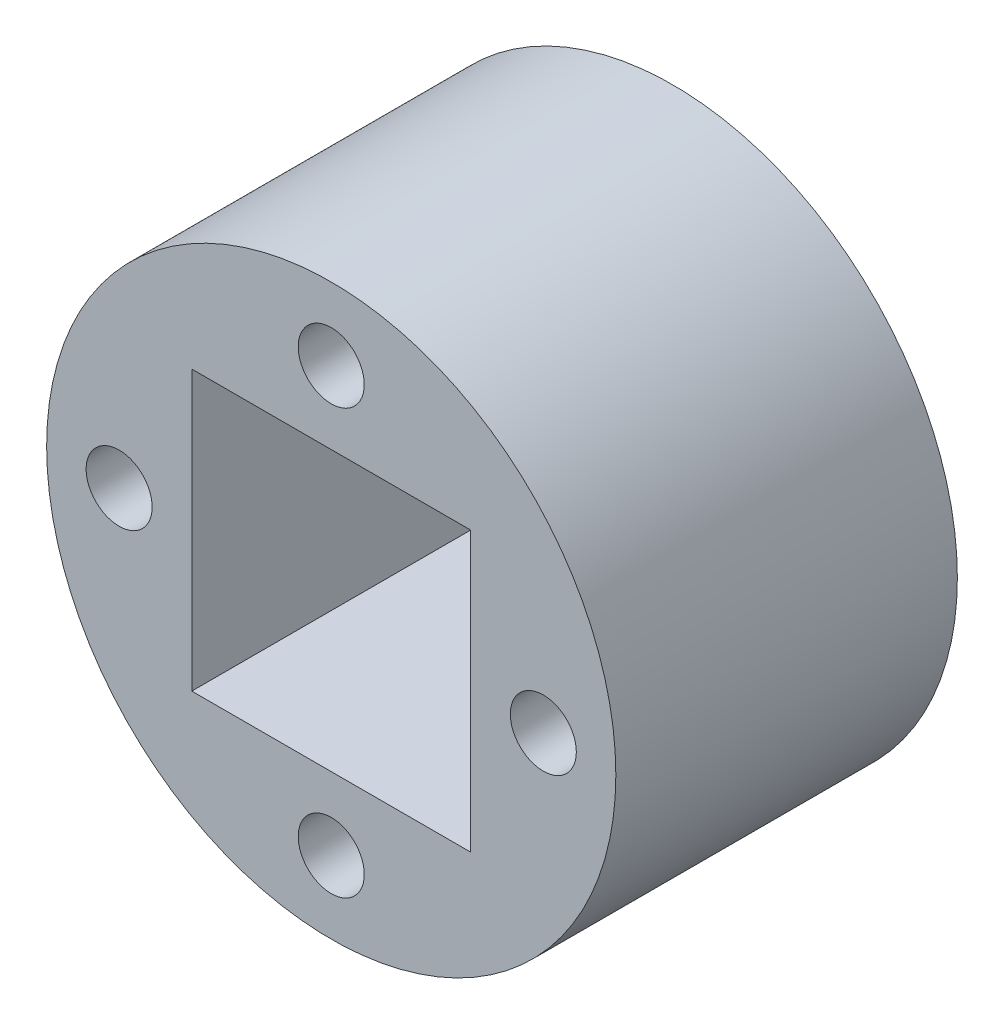
ISO-10303-21;
HEADER;
FILE_DESCRIPTION(('STEP AP214'),'2;1');
FILE_NAME('part.step','',(''),(''),'','','');
FILE_SCHEMA(('AUTOMOTIVE_DESIGN { 1 0 10303 214 1 1 1 1 }'));
ENDSEC;
DATA;
#1=APPLICATION_CONTEXT('core data for automotive mechanical design processes');
#2=APPLICATION_PROTOCOL_DEFINITION('international standard','automotive_design',2000,#1);
#3=PRODUCT_CONTEXT('',#1,'mechanical');
#4=PRODUCT('Part','Part','',(#3));
#5=PRODUCT_RELATED_PRODUCT_CATEGORY('part','',(#4));
#6=PRODUCT_DEFINITION_FORMATION('','',#4);
#7=PRODUCT_DEFINITION_CONTEXT('part definition',#1,'design');
#8=PRODUCT_DEFINITION('design','',#6,#7);
#9=PRODUCT_DEFINITION_SHAPE('','',#8);
#10=(LENGTH_UNIT() NAMED_UNIT(*) SI_UNIT(.MILLI.,.METRE.));
#11=(NAMED_UNIT(*) PLANE_ANGLE_UNIT() SI_UNIT($,.RADIAN.));
#12=(NAMED_UNIT(*) SI_UNIT($,.STERADIAN.) SOLID_ANGLE_UNIT());
#13=UNCERTAINTY_MEASURE_WITH_UNIT(LENGTH_MEASURE(1.E-05),#10,'distance_accuracy_value','');
#14=(GEOMETRIC_REPRESENTATION_CONTEXT(3) GLOBAL_UNCERTAINTY_ASSIGNED_CONTEXT((#13)) GLOBAL_UNIT_ASSIGNED_CONTEXT((#10,
#11,#12)) REPRESENTATION_CONTEXT('',''));
#15=CARTESIAN_POINT('',(0.,0.,0.));
#16=DIRECTION('',(0.,0.,1.));
#17=DIRECTION('',(1.,0.,0.));
#18=AXIS2_PLACEMENT_3D('',#15,#16,#17);
#19=CARTESIAN_POINT('',(0.,0.,7.5));
#20=DIRECTION('',(0.,0.,-1.));
#21=DIRECTION('',(-1.,0.,0.));
#22=AXIS2_PLACEMENT_3D('',#19,#20,#21);
#23=CYLINDRICAL_SURFACE('',#22,12.5);
#24=CARTESIAN_POINT('',(0.,0.,7.5));
#25=DIRECTION('',(0.,0.,1.));
#26=DIRECTION('',(1.,0.,0.));
#27=AXIS2_PLACEMENT_3D('',#24,#25,#26);
#28=CIRCLE('',#27,12.5);
#29=CARTESIAN_POINT('',(12.5,0.,7.5));
#30=VERTEX_POINT('',#29);
#31=EDGE_CURVE('E11',#30,#30,#28,.T.);
#32=ORIENTED_EDGE('',*,*,#31,.F.);
#33=EDGE_LOOP('',(#32));
#34=FACE_BOUND('',#33,.T.);
#35=CARTESIAN_POINT('',(0.,0.,-7.5));
#36=DIRECTION('',(0.,0.,1.));
#37=DIRECTION('',(1.,0.,0.));
#38=AXIS2_PLACEMENT_3D('',#35,#36,#37);
#39=CIRCLE('',#38,12.5);
#40=CARTESIAN_POINT('',(12.5,0.,-7.5));
#41=VERTEX_POINT('',#40);
#42=EDGE_CURVE('E37',#41,#41,#39,.T.);
#43=ORIENTED_EDGE('',*,*,#42,.T.);
#44=EDGE_LOOP('',(#43));
#45=FACE_BOUND('',#44,.T.);
#46=ADVANCED_FACE('F34',(#34,#45),#23,.T.);
#47=CARTESIAN_POINT('',(0.,0.,7.5));
#48=DIRECTION('',(0.,0.,1.));
#49=DIRECTION('',(1.,0.,0.));
#50=AXIS2_PLACEMENT_3D('',#47,#48,#49);
#51=PLANE('',#50);
#52=CARTESIAN_POINT('',(9.315,0.,7.5));
#53=DIRECTION('',(0.,0.,1.));
#54=DIRECTION('',(1.,0.,0.));
#55=AXIS2_PLACEMENT_3D('',#52,#53,#54);
#56=CIRCLE('',#55,1.45);
#57=CARTESIAN_POINT('',(10.765,0.,7.5));
#58=VERTEX_POINT('',#57);
#59=EDGE_CURVE('E119',#58,#58,#56,.T.);
#60=ORIENTED_EDGE('',*,*,#59,.F.);
#61=EDGE_LOOP('',(#60));
#62=FACE_BOUND('',#61,.T.);
#63=CARTESIAN_POINT('',(0.,-9.315,7.5));
#64=DIRECTION('',(0.,0.,1.));
#65=DIRECTION('',(1.,0.,0.));
#66=AXIS2_PLACEMENT_3D('',#63,#64,#65);
#67=CIRCLE('',#66,1.45);
#68=CARTESIAN_POINT('',(1.44999999999997,-9.315,7.5));
#69=VERTEX_POINT('',#68);
#70=EDGE_CURVE('E132',#69,#69,#67,.T.);
#71=ORIENTED_EDGE('',*,*,#70,.F.);
#72=EDGE_LOOP('',(#71));
#73=FACE_BOUND('',#72,.T.);
#74=CARTESIAN_POINT('',(-9.315,0.,7.5));
#75=DIRECTION('',(0.,0.,1.));
#76=DIRECTION('',(1.,0.,0.));
#77=AXIS2_PLACEMENT_3D('',#74,#75,#76);
#78=CIRCLE('',#77,1.45);
#79=CARTESIAN_POINT('',(-7.865,0.,7.5));
#80=VERTEX_POINT('',#79);
#81=EDGE_CURVE('E125',#80,#80,#78,.T.);
#82=ORIENTED_EDGE('',*,*,#81,.F.);
#83=EDGE_LOOP('',(#82));
#84=FACE_BOUND('',#83,.T.);
#85=CARTESIAN_POINT('',(0.,9.315,7.5));
#86=DIRECTION('',(0.,0.,1.));
#87=DIRECTION('',(1.,0.,0.));
#88=AXIS2_PLACEMENT_3D('',#85,#86,#87);
#89=CIRCLE('',#88,1.45);
#90=CARTESIAN_POINT('',(1.4500000000001,9.315,7.5));
#91=VERTEX_POINT('',#90);
#92=EDGE_CURVE('E126',#91,#91,#89,.T.);
#93=ORIENTED_EDGE('',*,*,#92,.F.);
#94=EDGE_LOOP('',(#93));
#95=FACE_BOUND('',#94,.T.);
#96=DIRECTION('',(0.,1.,0.));
#97=VECTOR('',#96,1.);
#98=CARTESIAN_POINT('',(6.125,6.125,7.5));
#99=LINE('',#98,#97);
#100=CARTESIAN_POINT('',(6.125,-6.125,7.5));
#101=VERTEX_POINT('',#100);
#102=CARTESIAN_POINT('',(6.125,6.125,7.5));
#103=VERTEX_POINT('',#102);
#104=EDGE_CURVE('E48',#101,#103,#99,.T.);
#105=ORIENTED_EDGE('',*,*,#104,.F.);
#106=DIRECTION('',(1.,0.,0.));
#107=VECTOR('',#106,1.);
#108=CARTESIAN_POINT('',(-6.125,-6.125,7.5));
#109=LINE('',#108,#107);
#110=CARTESIAN_POINT('',(-6.125,-6.125,7.5));
#111=VERTEX_POINT('',#110);
#112=EDGE_CURVE('E82',#111,#101,#109,.T.);
#113=ORIENTED_EDGE('',*,*,#112,.F.);
#114=DIRECTION('',(0.,-1.,0.));
#115=VECTOR('',#114,1.);
#116=CARTESIAN_POINT('',(-6.125,6.125,7.5));
#117=LINE('',#116,#115);
#118=CARTESIAN_POINT('',(-6.125,6.125,7.5));
#119=VERTEX_POINT('',#118);
#120=EDGE_CURVE('E101',#119,#111,#117,.T.);
#121=ORIENTED_EDGE('',*,*,#120,.F.);
#122=DIRECTION('',(-1.,0.,0.));
#123=VECTOR('',#122,1.);
#124=CARTESIAN_POINT('',(-6.125,6.125,7.5));
#125=LINE('',#124,#123);
#126=EDGE_CURVE('E95',#103,#119,#125,.T.);
#127=ORIENTED_EDGE('',*,*,#126,.F.);
#128=EDGE_LOOP('',(#105,#113,#121,#127));
#129=FACE_BOUND('',#128,.T.);
#130=ORIENTED_EDGE('',*,*,#31,.T.);
#131=EDGE_LOOP('',(#130));
#132=FACE_BOUND('',#131,.T.);
#133=ADVANCED_FACE('F113',(#62,#73,#84,#95,#129,#132),#51,.T.);
#134=CARTESIAN_POINT('',(0.,0.,-7.5));
#135=DIRECTION('',(0.,0.,1.));
#136=DIRECTION('',(1.,0.,0.));
#137=AXIS2_PLACEMENT_3D('',#134,#135,#136);
#138=PLANE('',#137);
#139=CARTESIAN_POINT('',(9.315,0.,-7.5));
#140=DIRECTION('',(0.,0.,1.));
#141=DIRECTION('',(1.,0.,0.));
#142=AXIS2_PLACEMENT_3D('',#139,#140,#141);
#143=CIRCLE('',#142,1.45);
#144=CARTESIAN_POINT('',(10.765,0.,-7.5));
#145=VERTEX_POINT('',#144);
#146=EDGE_CURVE('E117',#145,#145,#143,.F.);
#147=ORIENTED_EDGE('',*,*,#146,.F.);
#148=EDGE_LOOP('',(#147));
#149=FACE_BOUND('',#148,.T.);
#150=CARTESIAN_POINT('',(0.,-9.315,-7.5));
#151=DIRECTION('',(0.,0.,1.));
#152=DIRECTION('',(1.,0.,0.));
#153=AXIS2_PLACEMENT_3D('',#150,#151,#152);
#154=CIRCLE('',#153,1.45);
#155=CARTESIAN_POINT('',(1.44999999999997,-9.315,-7.5));
#156=VERTEX_POINT('',#155);
#157=EDGE_CURVE('E135',#156,#156,#154,.F.);
#158=ORIENTED_EDGE('',*,*,#157,.F.);
#159=EDGE_LOOP('',(#158));
#160=FACE_BOUND('',#159,.T.);
#161=CARTESIAN_POINT('',(-9.315,0.,-7.5));
#162=DIRECTION('',(0.,0.,1.));
#163=DIRECTION('',(1.,0.,0.));
#164=AXIS2_PLACEMENT_3D('',#161,#162,#163);
#165=CIRCLE('',#164,1.45);
#166=CARTESIAN_POINT('',(-7.865,0.,-7.5));
#167=VERTEX_POINT('',#166);
#168=EDGE_CURVE('E129',#167,#167,#165,.F.);
#169=ORIENTED_EDGE('',*,*,#168,.F.);
#170=EDGE_LOOP('',(#169));
#171=FACE_BOUND('',#170,.T.);
#172=CARTESIAN_POINT('',(0.,9.315,-7.5));
#173=DIRECTION('',(0.,0.,1.));
#174=DIRECTION('',(1.,0.,0.));
#175=AXIS2_PLACEMENT_3D('',#172,#173,#174);
#176=CIRCLE('',#175,1.45);
#177=CARTESIAN_POINT('',(1.4500000000001,9.315,-7.5));
#178=VERTEX_POINT('',#177);
#179=EDGE_CURVE('E122',#178,#178,#176,.F.);
#180=ORIENTED_EDGE('',*,*,#179,.F.);
#181=EDGE_LOOP('',(#180));
#182=FACE_BOUND('',#181,.T.);
#183=DIRECTION('',(-1.,0.,0.));
#184=VECTOR('',#183,1.);
#185=CARTESIAN_POINT('',(-6.125,-6.125,-7.5));
#186=LINE('',#185,#184);
#187=CARTESIAN_POINT('',(6.125,-6.125,-7.5));
#188=VERTEX_POINT('',#187);
#189=CARTESIAN_POINT('',(-6.125,-6.125,-7.5));
#190=VERTEX_POINT('',#189);
#191=EDGE_CURVE('E93',#188,#190,#186,.T.);
#192=ORIENTED_EDGE('',*,*,#191,.F.);
#193=DIRECTION('',(0.,-1.,0.));
#194=VECTOR('',#193,1.);
#195=CARTESIAN_POINT('',(6.125,6.125,-7.5));
#196=LINE('',#195,#194);
#197=CARTESIAN_POINT('',(6.125,6.125,-7.5));
#198=VERTEX_POINT('',#197);
#199=EDGE_CURVE('E76',#198,#188,#196,.T.);
#200=ORIENTED_EDGE('',*,*,#199,.F.);
#201=DIRECTION('',(1.,0.,0.));
#202=VECTOR('',#201,1.);
#203=CARTESIAN_POINT('',(-6.125,6.125,-7.5));
#204=LINE('',#203,#202);
#205=CARTESIAN_POINT('',(-6.125,6.125,-7.5));
#206=VERTEX_POINT('',#205);
#207=EDGE_CURVE('E85',#206,#198,#204,.T.);
#208=ORIENTED_EDGE('',*,*,#207,.F.);
#209=DIRECTION('',(0.,1.,0.));
#210=VECTOR('',#209,1.);
#211=CARTESIAN_POINT('',(-6.125,6.125,-7.5));
#212=LINE('',#211,#210);
#213=EDGE_CURVE('E56',#190,#206,#212,.T.);
#214=ORIENTED_EDGE('',*,*,#213,.F.);
#215=EDGE_LOOP('',(#192,#200,#208,#214));
#216=FACE_BOUND('',#215,.T.);
#217=ORIENTED_EDGE('',*,*,#42,.F.);
#218=EDGE_LOOP('',(#217));
#219=FACE_BOUND('',#218,.T.);
#220=ADVANCED_FACE('F90',(#149,#160,#171,#182,#216,#219),#138,.F.);
#221=CARTESIAN_POINT('',(6.125,6.125,-7.501));
#222=DIRECTION('',(1.,0.,0.));
#223=DIRECTION('',(0.,1.,0.));
#224=AXIS2_PLACEMENT_3D('',#221,#222,#223);
#225=PLANE('',#224);
#226=ORIENTED_EDGE('',*,*,#199,.T.);
#227=DIRECTION('',(0.,0.,1.));
#228=VECTOR('',#227,1.);
#229=CARTESIAN_POINT('',(6.125,-6.125,-7.501));
#230=LINE('',#229,#228);
#231=EDGE_CURVE('E88',#188,#101,#230,.T.);
#232=ORIENTED_EDGE('',*,*,#231,.T.);
#233=ORIENTED_EDGE('',*,*,#104,.T.);
#234=DIRECTION('',(0.,0.,1.));
#235=VECTOR('',#234,1.);
#236=CARTESIAN_POINT('',(6.125,6.125,-7.501));
#237=LINE('',#236,#235);
#238=EDGE_CURVE('E72',#198,#103,#237,.T.);
#239=ORIENTED_EDGE('',*,*,#238,.F.);
#240=EDGE_LOOP('',(#226,#232,#233,#239));
#241=FACE_BOUND('',#240,.T.);
#242=ADVANCED_FACE('F74',(#241),#225,.F.);
#243=CARTESIAN_POINT('',(-6.125,-6.125,-7.501));
#244=DIRECTION('',(0.,-1.,0.));
#245=DIRECTION('',(0.,0.,-1.));
#246=AXIS2_PLACEMENT_3D('',#243,#244,#245);
#247=PLANE('',#246);
#248=ORIENTED_EDGE('',*,*,#191,.T.);
#249=DIRECTION('',(0.,0.,1.));
#250=VECTOR('',#249,1.);
#251=CARTESIAN_POINT('',(-6.125,-6.125,-7.501));
#252=LINE('',#251,#250);
#253=EDGE_CURVE('E107',#190,#111,#252,.T.);
#254=ORIENTED_EDGE('',*,*,#253,.T.);
#255=ORIENTED_EDGE('',*,*,#112,.T.);
#256=ORIENTED_EDGE('',*,*,#231,.F.);
#257=EDGE_LOOP('',(#248,#254,#255,#256));
#258=FACE_BOUND('',#257,.T.);
#259=ADVANCED_FACE('F116',(#258),#247,.F.);
#260=CARTESIAN_POINT('',(-6.125,6.125,-7.501));
#261=DIRECTION('',(-1.,0.,0.));
#262=DIRECTION('',(0.,-1.,0.));
#263=AXIS2_PLACEMENT_3D('',#260,#261,#262);
#264=PLANE('',#263);
#265=ORIENTED_EDGE('',*,*,#213,.T.);
#266=DIRECTION('',(0.,0.,1.));
#267=VECTOR('',#266,1.);
#268=CARTESIAN_POINT('',(-6.125,6.125,-7.501));
#269=LINE('',#268,#267);
#270=EDGE_CURVE('E81',#206,#119,#269,.T.);
#271=ORIENTED_EDGE('',*,*,#270,.T.);
#272=ORIENTED_EDGE('',*,*,#120,.T.);
#273=ORIENTED_EDGE('',*,*,#253,.F.);
#274=EDGE_LOOP('',(#265,#271,#272,#273));
#275=FACE_BOUND('',#274,.T.);
#276=ADVANCED_FACE('F109',(#275),#264,.F.);
#277=CARTESIAN_POINT('',(-6.125,6.125,-7.501));
#278=DIRECTION('',(0.,1.,0.));
#279=DIRECTION('',(0.,0.,1.));
#280=AXIS2_PLACEMENT_3D('',#277,#278,#279);
#281=PLANE('',#280);
#282=ORIENTED_EDGE('',*,*,#207,.T.);
#283=ORIENTED_EDGE('',*,*,#238,.T.);
#284=ORIENTED_EDGE('',*,*,#126,.T.);
#285=ORIENTED_EDGE('',*,*,#270,.F.);
#286=EDGE_LOOP('',(#282,#283,#284,#285));
#287=FACE_BOUND('',#286,.T.);
#288=ADVANCED_FACE('F86',(#287),#281,.F.);
#289=CARTESIAN_POINT('',(0.,9.315,-7.501));
#290=DIRECTION('',(0.,0.,1.));
#291=DIRECTION('',(1.,0.,0.));
#292=AXIS2_PLACEMENT_3D('',#289,#290,#291);
#293=CYLINDRICAL_SURFACE('',#292,1.45);
#294=ORIENTED_EDGE('',*,*,#92,.T.);
#295=EDGE_LOOP('',(#294));
#296=FACE_BOUND('',#295,.T.);
#297=ORIENTED_EDGE('',*,*,#179,.T.);
#298=EDGE_LOOP('',(#297));
#299=FACE_BOUND('',#298,.T.);
#300=ADVANCED_FACE('F155',(#296,#299),#293,.F.);
#301=CARTESIAN_POINT('',(-9.315,0.,-7.501));
#302=DIRECTION('',(0.,0.,1.));
#303=DIRECTION('',(1.,0.,0.));
#304=AXIS2_PLACEMENT_3D('',#301,#302,#303);
#305=CYLINDRICAL_SURFACE('',#304,1.45);
#306=ORIENTED_EDGE('',*,*,#81,.T.);
#307=EDGE_LOOP('',(#306));
#308=FACE_BOUND('',#307,.T.);
#309=ORIENTED_EDGE('',*,*,#168,.T.);
#310=EDGE_LOOP('',(#309));
#311=FACE_BOUND('',#310,.T.);
#312=ADVANCED_FACE('F158',(#308,#311),#305,.F.);
#313=CARTESIAN_POINT('',(0.,-9.315,-7.501));
#314=DIRECTION('',(0.,0.,1.));
#315=DIRECTION('',(1.,0.,0.));
#316=AXIS2_PLACEMENT_3D('',#313,#314,#315);
#317=CYLINDRICAL_SURFACE('',#316,1.45);
#318=ORIENTED_EDGE('',*,*,#70,.T.);
#319=EDGE_LOOP('',(#318));
#320=FACE_BOUND('',#319,.T.);
#321=ORIENTED_EDGE('',*,*,#157,.T.);
#322=EDGE_LOOP('',(#321));
#323=FACE_BOUND('',#322,.T.);
#324=ADVANCED_FACE('F208',(#320,#323),#317,.F.);
#325=CARTESIAN_POINT('',(9.315,0.,-7.501));
#326=DIRECTION('',(0.,0.,1.));
#327=DIRECTION('',(1.,0.,0.));
#328=AXIS2_PLACEMENT_3D('',#325,#326,#327);
#329=CYLINDRICAL_SURFACE('',#328,1.45);
#330=ORIENTED_EDGE('',*,*,#59,.T.);
#331=EDGE_LOOP('',(#330));
#332=FACE_BOUND('',#331,.T.);
#333=ORIENTED_EDGE('',*,*,#146,.T.);
#334=EDGE_LOOP('',(#333));
#335=FACE_BOUND('',#334,.T.);
#336=ADVANCED_FACE('F143',(#332,#335),#329,.F.);
#337=CLOSED_SHELL('',(#46,#133,#220,#242,#259,#276,#288,#300,#312,#324,#336));
#338=MANIFOLD_SOLID_BREP('B2',#337);
#339=ADVANCED_BREP_SHAPE_REPRESENTATION('',(#18,#338),#14);
#340=SHAPE_DEFINITION_REPRESENTATION(#9,#339);
ENDSEC;
END-ISO-10303-21;
